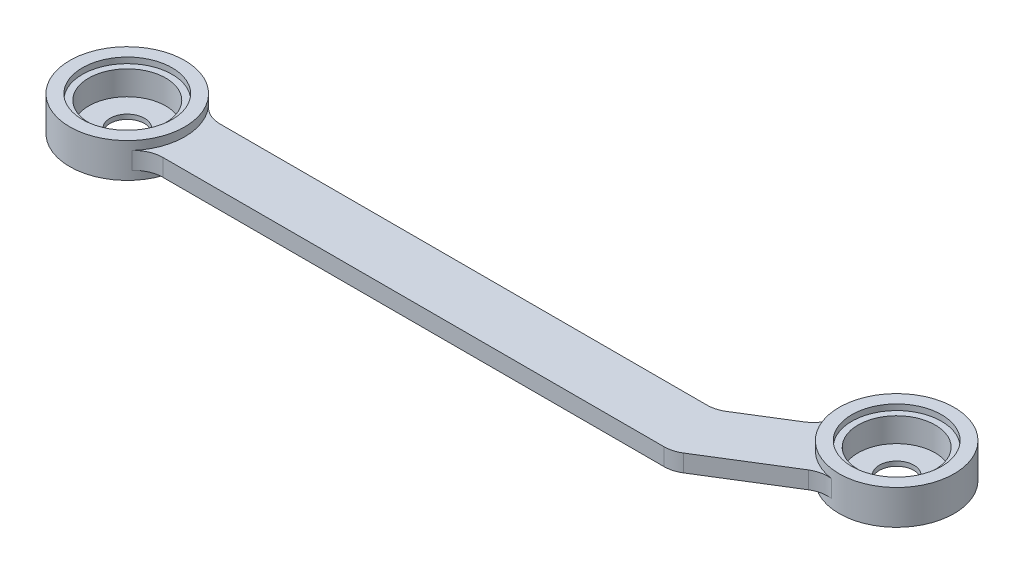
ISO-10303-21;
HEADER;
FILE_DESCRIPTION(('STEP AP214'),'2;1');
FILE_NAME('part.step','',(''),(''),'','','');
FILE_SCHEMA(('AUTOMOTIVE_DESIGN { 1 0 10303 214 1 1 1 1 }'));
ENDSEC;
DATA;
#1=APPLICATION_CONTEXT('core data for automotive mechanical design processes');
#2=APPLICATION_PROTOCOL_DEFINITION('international standard','automotive_design',2000,#1);
#3=PRODUCT_CONTEXT('',#1,'mechanical');
#4=PRODUCT('Part','Part','',(#3));
#5=PRODUCT_RELATED_PRODUCT_CATEGORY('part','',(#4));
#6=PRODUCT_DEFINITION_FORMATION('','',#4);
#7=PRODUCT_DEFINITION_CONTEXT('part definition',#1,'design');
#8=PRODUCT_DEFINITION('design','',#6,#7);
#9=PRODUCT_DEFINITION_SHAPE('','',#8);
#10=(LENGTH_UNIT() NAMED_UNIT(*) SI_UNIT(.MILLI.,.METRE.));
#11=(NAMED_UNIT(*) PLANE_ANGLE_UNIT() SI_UNIT($,.RADIAN.));
#12=(NAMED_UNIT(*) SI_UNIT($,.STERADIAN.) SOLID_ANGLE_UNIT());
#13=UNCERTAINTY_MEASURE_WITH_UNIT(LENGTH_MEASURE(1.E-05),#10,'distance_accuracy_value','');
#14=(GEOMETRIC_REPRESENTATION_CONTEXT(3) GLOBAL_UNCERTAINTY_ASSIGNED_CONTEXT((#13)) GLOBAL_UNIT_ASSIGNED_CONTEXT((#10,
#11,#12)) REPRESENTATION_CONTEXT('',''));
#15=CARTESIAN_POINT('',(0.,0.,0.));
#16=DIRECTION('',(0.,0.,1.));
#17=DIRECTION('',(1.,0.,0.));
#18=AXIS2_PLACEMENT_3D('',#15,#16,#17);
#19=CARTESIAN_POINT('',(11.180339887499,3.,-10.));
#20=DIRECTION('',(0.,-1.,0.));
#21=DIRECTION('',(0.,0.,-1.));
#22=AXIS2_PLACEMENT_3D('',#19,#20,#21);
#23=CYLINDRICAL_SURFACE('',#22,5.);
#24=DIRECTION('',(0.,-1.,0.));
#25=VECTOR('',#24,1.);
#26=CARTESIAN_POINT('',(11.180339887499,3.,-5.));
#27=LINE('',#26,#25);
#28=CARTESIAN_POINT('',(11.180339887499,1.5,-5.));
#29=VERTEX_POINT('',#28);
#30=CARTESIAN_POINT('',(11.180339887499,-1.5,-5.));
#31=VERTEX_POINT('',#30);
#32=EDGE_CURVE('E217',#29,#31,#27,.T.);
#33=ORIENTED_EDGE('',*,*,#32,.T.);
#34=CARTESIAN_POINT('',(11.180339887499,-1.5,-10.));
#35=DIRECTION('',(0.,-1.,0.));
#36=DIRECTION('',(0.,0.,-1.));
#37=AXIS2_PLACEMENT_3D('',#34,#35,#36);
#38=CIRCLE('',#37,5.);
#39=CARTESIAN_POINT('',(7.4535599249993,-1.5,-6.66666666666667));
#40=VERTEX_POINT('',#39);
#41=EDGE_CURVE('E348',#40,#31,#38,.F.);
#42=ORIENTED_EDGE('',*,*,#41,.F.);
#43=DIRECTION('',(0.,-1.,0.));
#44=VECTOR('',#43,1.);
#45=CARTESIAN_POINT('',(7.4535599249993,3.,-6.66666666666667));
#46=LINE('',#45,#44);
#47=CARTESIAN_POINT('',(7.4535599249993,1.5,-6.66666666666667));
#48=VERTEX_POINT('',#47);
#49=EDGE_CURVE('E11',#48,#40,#46,.T.);
#50=ORIENTED_EDGE('',*,*,#49,.F.);
#51=CARTESIAN_POINT('',(11.180339887499,1.5,-10.));
#52=DIRECTION('',(0.,1.,0.));
#53=DIRECTION('',(0.,0.,1.));
#54=AXIS2_PLACEMENT_3D('',#51,#52,#53);
#55=CIRCLE('',#54,5.);
#56=EDGE_CURVE('E277',#29,#48,#55,.F.);
#57=ORIENTED_EDGE('',*,*,#56,.F.);
#58=EDGE_LOOP('',(#33,#42,#50,#57));
#59=FACE_BOUND('',#58,.T.);
#60=ADVANCED_FACE('F39',(#59),#23,.F.);
#61=CARTESIAN_POINT('',(11.180339887499,3.,10.));
#62=DIRECTION('',(0.,-1.,0.));
#63=DIRECTION('',(0.,0.,-1.));
#64=AXIS2_PLACEMENT_3D('',#61,#62,#63);
#65=CYLINDRICAL_SURFACE('',#64,5.);
#66=DIRECTION('',(0.,-1.,0.));
#67=VECTOR('',#66,1.);
#68=CARTESIAN_POINT('',(7.4535599249993,3.,6.66666666666667));
#69=LINE('',#68,#67);
#70=CARTESIAN_POINT('',(7.4535599249993,1.5,6.66666666666667));
#71=VERTEX_POINT('',#70);
#72=CARTESIAN_POINT('',(7.4535599249993,-1.5,6.66666666666667));
#73=VERTEX_POINT('',#72);
#74=EDGE_CURVE('E49',#71,#73,#69,.T.);
#75=ORIENTED_EDGE('',*,*,#74,.T.);
#76=CARTESIAN_POINT('',(11.180339887499,-1.5,10.));
#77=DIRECTION('',(0.,-1.,0.));
#78=DIRECTION('',(0.,0.,-1.));
#79=AXIS2_PLACEMENT_3D('',#76,#77,#78);
#80=CIRCLE('',#79,5.);
#81=CARTESIAN_POINT('',(11.180339887499,-1.5,5.));
#82=VERTEX_POINT('',#81);
#83=EDGE_CURVE('E365',#82,#73,#80,.F.);
#84=ORIENTED_EDGE('',*,*,#83,.F.);
#85=DIRECTION('',(0.,-1.,0.));
#86=VECTOR('',#85,1.);
#87=CARTESIAN_POINT('',(11.180339887499,3.,5.));
#88=LINE('',#87,#86);
#89=CARTESIAN_POINT('',(11.180339887499,1.5,5.));
#90=VERTEX_POINT('',#89);
#91=EDGE_CURVE('E171',#90,#82,#88,.T.);
#92=ORIENTED_EDGE('',*,*,#91,.F.);
#93=CARTESIAN_POINT('',(11.180339887499,1.5,10.));
#94=DIRECTION('',(0.,1.,0.));
#95=DIRECTION('',(0.,0.,1.));
#96=AXIS2_PLACEMENT_3D('',#93,#94,#95);
#97=CIRCLE('',#96,5.);
#98=EDGE_CURVE('E284',#71,#90,#97,.F.);
#99=ORIENTED_EDGE('',*,*,#98,.F.);
#100=EDGE_LOOP('',(#75,#84,#92,#99));
#101=FACE_BOUND('',#100,.T.);
#102=ADVANCED_FACE('F337',(#101),#65,.F.);
#103=CARTESIAN_POINT('',(0.,3.,5.));
#104=DIRECTION('',(0.,0.,-1.));
#105=DIRECTION('',(-1.,0.,0.));
#106=AXIS2_PLACEMENT_3D('',#103,#104,#105);
#107=PLANE('',#106);
#108=DIRECTION('',(-1.,0.,0.));
#109=VECTOR('',#108,1.);
#110=CARTESIAN_POINT('',(0.,-1.5,5.));
#111=LINE('',#110,#109);
#112=CARTESIAN_POINT('',(98.3184692391875,-1.5,5.));
#113=VERTEX_POINT('',#112);
#114=EDGE_CURVE('E369',#113,#82,#111,.T.);
#115=ORIENTED_EDGE('',*,*,#114,.F.);
#116=DIRECTION('',(0.,-1.,0.));
#117=VECTOR('',#116,1.);
#118=CARTESIAN_POINT('',(98.3184692391875,3.,5.));
#119=LINE('',#118,#117);
#120=CARTESIAN_POINT('',(98.3184692391875,1.5,5.));
#121=VERTEX_POINT('',#120);
#122=EDGE_CURVE('E167',#121,#113,#119,.T.);
#123=ORIENTED_EDGE('',*,*,#122,.F.);
#124=DIRECTION('',(1.,0.,0.));
#125=VECTOR('',#124,1.);
#126=CARTESIAN_POINT('',(0.,1.5,5.));
#127=LINE('',#126,#125);
#128=EDGE_CURVE('E287',#90,#121,#127,.T.);
#129=ORIENTED_EDGE('',*,*,#128,.F.);
#130=ORIENTED_EDGE('',*,*,#91,.T.);
#131=EDGE_LOOP('',(#115,#123,#129,#130));
#132=FACE_BOUND('',#131,.T.);
#133=ADVANCED_FACE('F342',(#132),#107,.F.);
#134=CARTESIAN_POINT('',(98.3184692391875,3.,0.));
#135=DIRECTION('',(0.,-1.,0.));
#136=DIRECTION('',(0.,0.,-1.));
#137=AXIS2_PLACEMENT_3D('',#134,#135,#136);
#138=CYLINDRICAL_SURFACE('',#137,5.);
#139=ORIENTED_EDGE('',*,*,#122,.T.);
#140=CARTESIAN_POINT('',(98.3184692391875,-1.5,0.));
#141=DIRECTION('',(0.,-1.,0.));
#142=DIRECTION('',(0.,0.,-1.));
#143=AXIS2_PLACEMENT_3D('',#140,#141,#142);
#144=CIRCLE('',#143,5.);
#145=CARTESIAN_POINT('',(100.953895223522,-1.5,4.2490622354933));
#146=VERTEX_POINT('',#145);
#147=EDGE_CURVE('E372',#146,#113,#144,.T.);
#148=ORIENTED_EDGE('',*,*,#147,.F.);
#149=DIRECTION('',(0.,-1.,0.));
#150=VECTOR('',#149,1.);
#151=CARTESIAN_POINT('',(100.953895223522,3.,4.24906223549331));
#152=LINE('',#151,#150);
#153=CARTESIAN_POINT('',(100.953895223522,1.5,4.24906223549331));
#154=VERTEX_POINT('',#153);
#155=EDGE_CURVE('E158',#154,#146,#152,.T.);
#156=ORIENTED_EDGE('',*,*,#155,.F.);
#157=CARTESIAN_POINT('',(98.3184692391875,1.5,0.));
#158=DIRECTION('',(0.,1.,0.));
#159=DIRECTION('',(0.,0.,1.));
#160=AXIS2_PLACEMENT_3D('',#157,#158,#159);
#161=CIRCLE('',#160,5.);
#162=EDGE_CURVE('E290',#121,#154,#161,.T.);
#163=ORIENTED_EDGE('',*,*,#162,.F.);
#164=EDGE_LOOP('',(#139,#148,#156,#163));
#165=FACE_BOUND('',#164,.T.);
#166=ADVANCED_FACE('F381',(#165),#138,.T.);
#167=CARTESIAN_POINT('',(29.9501455938231,3.,48.2882210871058));
#168=DIRECTION('',(-0.527085196866867,0.,-0.849812447098662));
#169=DIRECTION('',(-0.849812447098662,0.,0.527085196866867));
#170=AXIS2_PLACEMENT_3D('',#167,#168,#169);
#171=PLANE('',#170);
#172=DIRECTION('',(-0.849812447098662,0.,0.527085196866867));
#173=VECTOR('',#172,1.);
#174=CARTESIAN_POINT('',(29.9501455938231,-1.5,48.2882210871058));
#175=LINE('',#174,#173);
#176=CARTESIAN_POINT('',(114.335793642608,-1.5,-4.05088746135743));
#177=VERTEX_POINT('',#176);
#178=EDGE_CURVE('E149',#177,#146,#175,.T.);
#179=ORIENTED_EDGE('',*,*,#178,.F.);
#180=DIRECTION('',(0.,-1.,0.));
#181=VECTOR('',#180,1.);
#182=CARTESIAN_POINT('',(114.335793642608,3.,-4.05088746135743));
#183=LINE('',#182,#181);
#184=CARTESIAN_POINT('',(114.335793642608,1.5,-4.05088746135744));
#185=VERTEX_POINT('',#184);
#186=EDGE_CURVE('E147',#185,#177,#183,.T.);
#187=ORIENTED_EDGE('',*,*,#186,.F.);
#188=DIRECTION('',(0.849812447098662,0.,-0.527085196866867));
#189=VECTOR('',#188,1.);
#190=CARTESIAN_POINT('',(29.9501455938231,1.5,48.2882210871058));
#191=LINE('',#190,#189);
#192=EDGE_CURVE('E64',#154,#185,#191,.T.);
#193=ORIENTED_EDGE('',*,*,#192,.F.);
#194=ORIENTED_EDGE('',*,*,#155,.T.);
#195=EDGE_LOOP('',(#179,#187,#193,#194));
#196=FACE_BOUND('',#195,.T.);
#197=ADVANCED_FACE('F384',(#196),#171,.F.);
#198=CARTESIAN_POINT('',(116.971219626942,3.,0.19817477413587));
#199=DIRECTION('',(0.,-1.,0.));
#200=DIRECTION('',(0.,0.,-1.));
#201=AXIS2_PLACEMENT_3D('',#198,#199,#200);
#202=CYLINDRICAL_SURFACE('',#201,5.);
#203=CARTESIAN_POINT('',(116.971219626942,-1.5,0.19817477413587));
#204=DIRECTION('',(0.,-1.,0.));
#205=DIRECTION('',(0.,0.,-1.));
#206=AXIS2_PLACEMENT_3D('',#203,#204,#205);
#207=CIRCLE('',#206,5.);
#208=CARTESIAN_POINT('',(117.680813084628,-1.5,-4.75121681724276));
#209=VERTEX_POINT('',#208);
#210=EDGE_CURVE('E134',#209,#177,#207,.F.);
#211=ORIENTED_EDGE('',*,*,#210,.F.);
#212=DIRECTION('',(0.,-1.,0.));
#213=VECTOR('',#212,1.);
#214=CARTESIAN_POINT('',(117.680813084628,3.,-4.75121681724276));
#215=LINE('',#214,#213);
#216=CARTESIAN_POINT('',(117.680813084628,1.5,-4.75121681724276));
#217=VERTEX_POINT('',#216);
#218=EDGE_CURVE('E145',#217,#209,#215,.T.);
#219=ORIENTED_EDGE('',*,*,#218,.F.);
#220=CARTESIAN_POINT('',(116.971219626942,1.5,0.19817477413587));
#221=DIRECTION('',(0.,1.,0.));
#222=DIRECTION('',(0.,0.,1.));
#223=AXIS2_PLACEMENT_3D('',#220,#221,#222);
#224=CIRCLE('',#223,5.);
#225=EDGE_CURVE('E295',#185,#217,#224,.F.);
#226=ORIENTED_EDGE('',*,*,#225,.F.);
#227=ORIENTED_EDGE('',*,*,#186,.T.);
#228=EDGE_LOOP('',(#211,#219,#226,#227));
#229=FACE_BOUND('',#228,.T.);
#230=ADVANCED_FACE('F144',(#229),#202,.F.);
#231=CARTESIAN_POINT('',(104.108710614504,3.,-15.1611189297056));
#232=DIRECTION('',(0.,-1.,0.));
#233=DIRECTION('',(0.,0.,-1.));
#234=AXIS2_PLACEMENT_3D('',#231,#232,#233);
#235=CYLINDRICAL_SURFACE('',#234,4.99999999999999);
#236=CARTESIAN_POINT('',(104.108710614504,-1.5,-15.1611189297056));
#237=DIRECTION('',(0.,-1.,0.));
#238=DIRECTION('',(0.,0.,-1.));
#239=AXIS2_PLACEMENT_3D('',#236,#237,#238);
#240=CIRCLE('',#239,4.99999999999999);
#241=CARTESIAN_POINT('',(106.744136598838,-1.5,-10.9120566942123));
#242=VERTEX_POINT('',#241);
#243=CARTESIAN_POINT('',(109.105807076336,-1.5,-14.990745953137));
#244=VERTEX_POINT('',#243);
#245=EDGE_CURVE('E137',#242,#244,#240,.F.);
#246=ORIENTED_EDGE('',*,*,#245,.F.);
#247=DIRECTION('',(0.,-1.,0.));
#248=VECTOR('',#247,1.);
#249=CARTESIAN_POINT('',(106.744136598838,3.,-10.9120566942122));
#250=LINE('',#249,#248);
#251=CARTESIAN_POINT('',(106.744136598838,1.5,-10.9120566942122));
#252=VERTEX_POINT('',#251);
#253=EDGE_CURVE('E160',#252,#242,#250,.T.);
#254=ORIENTED_EDGE('',*,*,#253,.F.);
#255=CARTESIAN_POINT('',(104.108710614504,1.5,-15.1611189297056));
#256=DIRECTION('',(0.,1.,0.));
#257=DIRECTION('',(0.,0.,1.));
#258=AXIS2_PLACEMENT_3D('',#255,#256,#257);
#259=CIRCLE('',#258,4.99999999999999);
#260=CARTESIAN_POINT('',(109.105807076336,1.5,-14.990745953137));
#261=VERTEX_POINT('',#260);
#262=EDGE_CURVE('E257',#261,#252,#259,.F.);
#263=ORIENTED_EDGE('',*,*,#262,.F.);
#264=DIRECTION('',(0.,-1.,0.));
#265=VECTOR('',#264,1.);
#266=CARTESIAN_POINT('',(109.105807076336,3.,-14.990745953137));
#267=LINE('',#266,#265);
#268=EDGE_CURVE('E154',#261,#244,#267,.T.);
#269=ORIENTED_EDGE('',*,*,#268,.T.);
#270=EDGE_LOOP('',(#246,#254,#263,#269));
#271=FACE_BOUND('',#270,.T.);
#272=ADVANCED_FACE('F256',(#271),#235,.F.);
#273=CARTESIAN_POINT('',(24.7677611525447,3.,39.9327316329765));
#274=DIRECTION('',(-0.527085196866867,0.,-0.849812447098662));
#275=DIRECTION('',(-0.849812447098662,0.,0.527085196866867));
#276=AXIS2_PLACEMENT_3D('',#273,#274,#275);
#277=PLANE('',#276);
#278=ORIENTED_EDGE('',*,*,#253,.T.);
#279=DIRECTION('',(0.849812447098662,0.,-0.527085196866867));
#280=VECTOR('',#279,1.);
#281=CARTESIAN_POINT('',(24.7677611525447,-1.5,39.9327316329765));
#282=LINE('',#281,#280);
#283=CARTESIAN_POINT('',(98.4229332459612,-1.5,-5.75093776450671));
#284=VERTEX_POINT('',#283);
#285=EDGE_CURVE('E252',#284,#242,#282,.T.);
#286=ORIENTED_EDGE('',*,*,#285,.F.);
#287=DIRECTION('',(0.,-1.,0.));
#288=VECTOR('',#287,1.);
#289=CARTESIAN_POINT('',(98.4229332459612,3.,-5.75093776450671));
#290=LINE('',#289,#288);
#291=CARTESIAN_POINT('',(98.4229332459612,1.5,-5.75093776450671));
#292=VERTEX_POINT('',#291);
#293=EDGE_CURVE('E241',#292,#284,#290,.T.);
#294=ORIENTED_EDGE('',*,*,#293,.F.);
#295=DIRECTION('',(-0.849812447098662,0.,0.527085196866867));
#296=VECTOR('',#295,1.);
#297=CARTESIAN_POINT('',(24.7677611525447,1.5,39.9327316329765));
#298=LINE('',#297,#296);
#299=EDGE_CURVE('E253',#252,#292,#298,.T.);
#300=ORIENTED_EDGE('',*,*,#299,.F.);
#301=EDGE_LOOP('',(#278,#286,#294,#300));
#302=FACE_BOUND('',#301,.T.);
#303=ADVANCED_FACE('F250',(#302),#277,.T.);
#304=CARTESIAN_POINT('',(95.7875072616268,3.,-10.));
#305=DIRECTION('',(0.,-1.,0.));
#306=DIRECTION('',(0.,0.,-1.));
#307=AXIS2_PLACEMENT_3D('',#304,#305,#306);
#308=CYLINDRICAL_SURFACE('',#307,5.);
#309=CARTESIAN_POINT('',(95.7875072616268,-1.5,-10.));
#310=DIRECTION('',(0.,-1.,0.));
#311=DIRECTION('',(0.,0.,-1.));
#312=AXIS2_PLACEMENT_3D('',#309,#310,#311);
#313=CIRCLE('',#312,5.);
#314=CARTESIAN_POINT('',(95.7875072616268,-1.5,-5.));
#315=VERTEX_POINT('',#314);
#316=EDGE_CURVE('E263',#315,#284,#313,.F.);
#317=ORIENTED_EDGE('',*,*,#316,.F.);
#318=DIRECTION('',(0.,-1.,0.));
#319=VECTOR('',#318,1.);
#320=CARTESIAN_POINT('',(95.7875072616268,3.,-5.));
#321=LINE('',#320,#319);
#322=CARTESIAN_POINT('',(95.7875072616268,1.5,-5.));
#323=VERTEX_POINT('',#322);
#324=EDGE_CURVE('E237',#323,#315,#321,.T.);
#325=ORIENTED_EDGE('',*,*,#324,.F.);
#326=CARTESIAN_POINT('',(95.7875072616268,1.5,-10.));
#327=DIRECTION('',(0.,1.,0.));
#328=DIRECTION('',(0.,0.,1.));
#329=AXIS2_PLACEMENT_3D('',#326,#327,#328);
#330=CIRCLE('',#329,5.);
#331=EDGE_CURVE('E271',#292,#323,#330,.F.);
#332=ORIENTED_EDGE('',*,*,#331,.F.);
#333=ORIENTED_EDGE('',*,*,#293,.T.);
#334=EDGE_LOOP('',(#317,#325,#332,#333));
#335=FACE_BOUND('',#334,.T.);
#336=ADVANCED_FACE('F406',(#335),#308,.F.);
#337=CARTESIAN_POINT('',(0.,3.,-5.));
#338=DIRECTION('',(0.,0.,-1.));
#339=DIRECTION('',(-1.,0.,0.));
#340=AXIS2_PLACEMENT_3D('',#337,#338,#339);
#341=PLANE('',#340);
#342=ORIENTED_EDGE('',*,*,#324,.T.);
#343=DIRECTION('',(1.,0.,0.));
#344=VECTOR('',#343,1.);
#345=CARTESIAN_POINT('',(0.,-1.5,-5.));
#346=LINE('',#345,#344);
#347=EDGE_CURVE('E354',#31,#315,#346,.T.);
#348=ORIENTED_EDGE('',*,*,#347,.F.);
#349=ORIENTED_EDGE('',*,*,#32,.F.);
#350=DIRECTION('',(-1.,0.,0.));
#351=VECTOR('',#350,1.);
#352=CARTESIAN_POINT('',(0.,1.5,-5.));
#353=LINE('',#352,#351);
#354=EDGE_CURVE('E274',#323,#29,#353,.T.);
#355=ORIENTED_EDGE('',*,*,#354,.F.);
#356=EDGE_LOOP('',(#342,#348,#349,#355));
#357=FACE_BOUND('',#356,.T.);
#358=ADVANCED_FACE('F352',(#357),#341,.T.);
#359=CARTESIAN_POINT('',(0.,-3.,0.));
#360=DIRECTION('',(0.,1.,0.));
#361=DIRECTION('',(0.,0.,1.));
#362=AXIS2_PLACEMENT_3D('',#359,#360,#361);
#363=PLANE('',#362);
#364=CARTESIAN_POINT('',(119.1,-3.,-14.65));
#365=DIRECTION('',(0.,1.,0.));
#366=DIRECTION('',(0.,0.,1.));
#367=AXIS2_PLACEMENT_3D('',#364,#365,#366);
#368=CIRCLE('',#367,3.00000000000001);
#369=CARTESIAN_POINT('',(119.1,-3.,-11.65));
#370=VERTEX_POINT('',#369);
#371=EDGE_CURVE('E213',#370,#370,#368,.T.);
#372=ORIENTED_EDGE('',*,*,#371,.T.);
#373=EDGE_LOOP('',(#372));
#374=FACE_BOUND('',#373,.T.);
#375=CARTESIAN_POINT('',(119.1,-3.,-14.65));
#376=DIRECTION('',(0.,1.,0.));
#377=DIRECTION('',(0.,0.,1.));
#378=AXIS2_PLACEMENT_3D('',#375,#376,#377);
#379=CIRCLE('',#378,9.99999999999999);
#380=CARTESIAN_POINT('',(119.1,-3.,-4.65));
#381=VERTEX_POINT('',#380);
#382=EDGE_CURVE('E227',#381,#381,#379,.T.);
#383=ORIENTED_EDGE('',*,*,#382,.F.);
#384=EDGE_LOOP('',(#383));
#385=FACE_BOUND('',#384,.T.);
#386=ADVANCED_FACE('F413',(#374,#385),#363,.F.);
#387=CARTESIAN_POINT('',(0.,-3.,0.));
#388=DIRECTION('',(0.,1.,0.));
#389=DIRECTION('',(0.,0.,1.));
#390=AXIS2_PLACEMENT_3D('',#387,#388,#389);
#391=CIRCLE('',#390,3.);
#392=CARTESIAN_POINT('',(0.,-3.,3.));
#393=VERTEX_POINT('',#392);
#394=EDGE_CURVE('E218',#393,#393,#391,.T.);
#395=ORIENTED_EDGE('',*,*,#394,.T.);
#396=EDGE_LOOP('',(#395));
#397=FACE_BOUND('',#396,.T.);
#398=CARTESIAN_POINT('',(0.,-3.,0.));
#399=DIRECTION('',(0.,1.,0.));
#400=DIRECTION('',(0.,0.,1.));
#401=AXIS2_PLACEMENT_3D('',#398,#399,#400);
#402=CIRCLE('',#401,10.);
#403=CARTESIAN_POINT('',(0.,-3.,10.));
#404=VERTEX_POINT('',#403);
#405=EDGE_CURVE('E222',#404,#404,#402,.T.);
#406=ORIENTED_EDGE('',*,*,#405,.F.);
#407=EDGE_LOOP('',(#406));
#408=FACE_BOUND('',#407,.T.);
#409=ADVANCED_FACE('F445',(#397,#408),#363,.F.);
#410=CARTESIAN_POINT('',(0.,3.,0.));
#411=DIRECTION('',(0.,1.,0.));
#412=DIRECTION('',(0.,0.,1.));
#413=AXIS2_PLACEMENT_3D('',#410,#411,#412);
#414=PLANE('',#413);
#415=CARTESIAN_POINT('',(119.1,3.,-14.65));
#416=DIRECTION('',(0.,1.,0.));
#417=DIRECTION('',(0.,0.,1.));
#418=AXIS2_PLACEMENT_3D('',#415,#416,#417);
#419=CIRCLE('',#418,7.79999999999998);
#420=CARTESIAN_POINT('',(119.1,3.,-6.85000000000002));
#421=VERTEX_POINT('',#420);
#422=EDGE_CURVE('E198',#421,#421,#419,.T.);
#423=ORIENTED_EDGE('',*,*,#422,.F.);
#424=EDGE_LOOP('',(#423));
#425=FACE_BOUND('',#424,.T.);
#426=CARTESIAN_POINT('',(119.1,3.,-14.65));
#427=DIRECTION('',(0.,1.,0.));
#428=DIRECTION('',(0.,0.,1.));
#429=AXIS2_PLACEMENT_3D('',#426,#427,#428);
#430=CIRCLE('',#429,9.99999999999999);
#431=CARTESIAN_POINT('',(119.1,3.,-4.65));
#432=VERTEX_POINT('',#431);
#433=EDGE_CURVE('E212',#432,#432,#430,.T.);
#434=ORIENTED_EDGE('',*,*,#433,.T.);
#435=EDGE_LOOP('',(#434));
#436=FACE_BOUND('',#435,.T.);
#437=ADVANCED_FACE('F316',(#425,#436),#414,.T.);
#438=CARTESIAN_POINT('',(0.,3.,0.));
#439=DIRECTION('',(0.,1.,0.));
#440=DIRECTION('',(0.,0.,1.));
#441=AXIS2_PLACEMENT_3D('',#438,#439,#440);
#442=CIRCLE('',#441,7.8);
#443=CARTESIAN_POINT('',(0.,3.,7.8));
#444=VERTEX_POINT('',#443);
#445=EDGE_CURVE('E204',#444,#444,#442,.T.);
#446=ORIENTED_EDGE('',*,*,#445,.F.);
#447=EDGE_LOOP('',(#446));
#448=FACE_BOUND('',#447,.T.);
#449=CARTESIAN_POINT('',(0.,3.,0.));
#450=DIRECTION('',(0.,1.,0.));
#451=DIRECTION('',(0.,0.,1.));
#452=AXIS2_PLACEMENT_3D('',#449,#450,#451);
#453=CIRCLE('',#452,10.);
#454=CARTESIAN_POINT('',(0.,3.,10.));
#455=VERTEX_POINT('',#454);
#456=EDGE_CURVE('E208',#455,#455,#453,.T.);
#457=ORIENTED_EDGE('',*,*,#456,.T.);
#458=EDGE_LOOP('',(#457));
#459=FACE_BOUND('',#458,.T.);
#460=ADVANCED_FACE('F313',(#448,#459),#414,.T.);
#461=CARTESIAN_POINT('',(0.,3.,0.));
#462=DIRECTION('',(0.,-1.,0.));
#463=DIRECTION('',(0.,0.,-1.));
#464=AXIS2_PLACEMENT_3D('',#461,#462,#463);
#465=CYLINDRICAL_SURFACE('',#464,3.);
#466=ORIENTED_EDGE('',*,*,#394,.F.);
#467=EDGE_LOOP('',(#466));
#468=FACE_BOUND('',#467,.T.);
#469=CARTESIAN_POINT('',(0.,-2.2,0.));
#470=DIRECTION('',(0.,1.,0.));
#471=DIRECTION('',(0.,0.,1.));
#472=AXIS2_PLACEMENT_3D('',#469,#470,#471);
#473=CIRCLE('',#472,3.);
#474=CARTESIAN_POINT('',(0.,-2.2,3.));
#475=VERTEX_POINT('',#474);
#476=EDGE_CURVE('E43',#475,#475,#473,.T.);
#477=ORIENTED_EDGE('',*,*,#476,.T.);
#478=EDGE_LOOP('',(#477));
#479=FACE_BOUND('',#478,.T.);
#480=ADVANCED_FACE('F41',(#468,#479),#465,.F.);
#481=CARTESIAN_POINT('',(119.1,3.,-14.65));
#482=DIRECTION('',(0.,-1.,0.));
#483=DIRECTION('',(0.,0.,-1.));
#484=AXIS2_PLACEMENT_3D('',#481,#482,#483);
#485=CYLINDRICAL_SURFACE('',#484,3.00000000000001);
#486=ORIENTED_EDGE('',*,*,#371,.F.);
#487=EDGE_LOOP('',(#486));
#488=FACE_BOUND('',#487,.T.);
#489=CARTESIAN_POINT('',(119.1,-2.2,-14.65));
#490=DIRECTION('',(0.,1.,0.));
#491=DIRECTION('',(0.,0.,1.));
#492=AXIS2_PLACEMENT_3D('',#489,#490,#491);
#493=CIRCLE('',#492,3.00000000000001);
#494=CARTESIAN_POINT('',(119.1,-2.2,-11.65));
#495=VERTEX_POINT('',#494);
#496=EDGE_CURVE('E186',#495,#495,#493,.T.);
#497=ORIENTED_EDGE('',*,*,#496,.T.);
#498=EDGE_LOOP('',(#497));
#499=FACE_BOUND('',#498,.T.);
#500=ADVANCED_FACE('F322',(#488,#499),#485,.F.);
#501=CARTESIAN_POINT('',(0.,3.,0.));
#502=DIRECTION('',(0.,-1.,0.));
#503=DIRECTION('',(0.,0.,-1.));
#504=AXIS2_PLACEMENT_3D('',#501,#502,#503);
#505=CYLINDRICAL_SURFACE('',#504,10.);
#506=ORIENTED_EDGE('',*,*,#405,.T.);
#507=EDGE_LOOP('',(#506));
#508=FACE_BOUND('',#507,.T.);
#509=CARTESIAN_POINT('',(0.,1.5,0.));
#510=DIRECTION('',(0.,1.,0.));
#511=DIRECTION('',(0.,0.,1.));
#512=AXIS2_PLACEMENT_3D('',#509,#510,#511);
#513=CIRCLE('',#512,10.);
#514=EDGE_CURVE('E281',#71,#48,#513,.T.);
#515=ORIENTED_EDGE('',*,*,#514,.T.);
#516=ORIENTED_EDGE('',*,*,#49,.T.);
#517=CARTESIAN_POINT('',(0.,-1.5,0.));
#518=DIRECTION('',(0.,-1.,0.));
#519=DIRECTION('',(0.,0.,-1.));
#520=AXIS2_PLACEMENT_3D('',#517,#518,#519);
#521=CIRCLE('',#520,10.);
#522=EDGE_CURVE('E360',#40,#73,#521,.T.);
#523=ORIENTED_EDGE('',*,*,#522,.T.);
#524=ORIENTED_EDGE('',*,*,#74,.F.);
#525=EDGE_LOOP('',(#515,#516,#523,#524));
#526=FACE_BOUND('',#525,.T.);
#527=ORIENTED_EDGE('',*,*,#456,.F.);
#528=EDGE_LOOP('',(#527));
#529=FACE_BOUND('',#528,.T.);
#530=ADVANCED_FACE('F320',(#508,#526,#529),#505,.T.);
#531=CARTESIAN_POINT('',(119.1,3.,-14.65));
#532=DIRECTION('',(0.,-1.,0.));
#533=DIRECTION('',(0.,0.,-1.));
#534=AXIS2_PLACEMENT_3D('',#531,#532,#533);
#535=CYLINDRICAL_SURFACE('',#534,9.99999999999999);
#536=ORIENTED_EDGE('',*,*,#382,.T.);
#537=EDGE_LOOP('',(#536));
#538=FACE_BOUND('',#537,.T.);
#539=CARTESIAN_POINT('',(119.1,1.5,-14.65));
#540=DIRECTION('',(0.,1.,0.));
#541=DIRECTION('',(0.,0.,1.));
#542=AXIS2_PLACEMENT_3D('',#539,#540,#541);
#543=CIRCLE('',#542,9.99999999999999);
#544=EDGE_CURVE('E57',#261,#217,#543,.T.);
#545=ORIENTED_EDGE('',*,*,#544,.T.);
#546=ORIENTED_EDGE('',*,*,#218,.T.);
#547=CARTESIAN_POINT('',(119.1,-1.5,-14.65));
#548=DIRECTION('',(0.,-1.,0.));
#549=DIRECTION('',(0.,0.,-1.));
#550=AXIS2_PLACEMENT_3D('',#547,#548,#549);
#551=CIRCLE('',#550,9.99999999999999);
#552=EDGE_CURVE('E131',#209,#244,#551,.T.);
#553=ORIENTED_EDGE('',*,*,#552,.T.);
#554=ORIENTED_EDGE('',*,*,#268,.F.);
#555=EDGE_LOOP('',(#545,#546,#553,#554));
#556=FACE_BOUND('',#555,.T.);
#557=ORIENTED_EDGE('',*,*,#433,.F.);
#558=EDGE_LOOP('',(#557));
#559=FACE_BOUND('',#558,.T.);
#560=ADVANCED_FACE('F151',(#538,#556,#559),#535,.T.);
#561=CARTESIAN_POINT('',(119.1,2.,-14.65));
#562=DIRECTION('',(0.,1.,0.));
#563=DIRECTION('',(0.,0.,1.));
#564=AXIS2_PLACEMENT_3D('',#561,#562,#563);
#565=CYLINDRICAL_SURFACE('',#564,7.79999999999998);
#566=CARTESIAN_POINT('',(119.1,2.,-14.65));
#567=DIRECTION('',(0.,1.,0.));
#568=DIRECTION('',(0.,0.,1.));
#569=AXIS2_PLACEMENT_3D('',#566,#567,#568);
#570=CIRCLE('',#569,7.79999999999998);
#571=CARTESIAN_POINT('',(119.1,2.,-6.85000000000002));
#572=VERTEX_POINT('',#571);
#573=EDGE_CURVE('E193',#572,#572,#570,.T.);
#574=ORIENTED_EDGE('',*,*,#573,.F.);
#575=EDGE_LOOP('',(#574));
#576=FACE_BOUND('',#575,.T.);
#577=ORIENTED_EDGE('',*,*,#422,.T.);
#578=EDGE_LOOP('',(#577));
#579=FACE_BOUND('',#578,.T.);
#580=ADVANCED_FACE('F329',(#576,#579),#565,.F.);
#581=CARTESIAN_POINT('',(119.1,2.,-14.65));
#582=DIRECTION('',(0.,1.,0.));
#583=DIRECTION('',(0.,0.,1.));
#584=AXIS2_PLACEMENT_3D('',#581,#582,#583);
#585=PLANE('',#584);
#586=CARTESIAN_POINT('',(119.1,2.,-14.65));
#587=DIRECTION('',(0.,1.,0.));
#588=DIRECTION('',(0.,0.,1.));
#589=AXIS2_PLACEMENT_3D('',#586,#587,#588);
#590=CIRCLE('',#589,6.69999999999999);
#591=CARTESIAN_POINT('',(119.1,2.,-7.95000000000001));
#592=VERTEX_POINT('',#591);
#593=EDGE_CURVE('E182',#592,#592,#590,.T.);
#594=ORIENTED_EDGE('',*,*,#593,.F.);
#595=EDGE_LOOP('',(#594));
#596=FACE_BOUND('',#595,.T.);
#597=ORIENTED_EDGE('',*,*,#573,.T.);
#598=EDGE_LOOP('',(#597));
#599=FACE_BOUND('',#598,.T.);
#600=ADVANCED_FACE('F537',(#596,#599),#585,.T.);
#601=CARTESIAN_POINT('',(0.,2.,0.));
#602=DIRECTION('',(0.,1.,0.));
#603=DIRECTION('',(0.,0.,1.));
#604=AXIS2_PLACEMENT_3D('',#601,#602,#603);
#605=CYLINDRICAL_SURFACE('',#604,7.8);
#606=CARTESIAN_POINT('',(0.,2.,0.));
#607=DIRECTION('',(0.,1.,0.));
#608=DIRECTION('',(0.,0.,1.));
#609=AXIS2_PLACEMENT_3D('',#606,#607,#608);
#610=CIRCLE('',#609,7.8);
#611=CARTESIAN_POINT('',(0.,2.,7.8));
#612=VERTEX_POINT('',#611);
#613=EDGE_CURVE('E223',#612,#612,#610,.T.);
#614=ORIENTED_EDGE('',*,*,#613,.F.);
#615=EDGE_LOOP('',(#614));
#616=FACE_BOUND('',#615,.T.);
#617=ORIENTED_EDGE('',*,*,#445,.T.);
#618=EDGE_LOOP('',(#617));
#619=FACE_BOUND('',#618,.T.);
#620=ADVANCED_FACE('F311',(#616,#619),#605,.F.);
#621=CARTESIAN_POINT('',(0.,2.,0.));
#622=DIRECTION('',(0.,1.,0.));
#623=DIRECTION('',(0.,0.,1.));
#624=AXIS2_PLACEMENT_3D('',#621,#622,#623);
#625=PLANE('',#624);
#626=CARTESIAN_POINT('',(0.,2.,0.));
#627=DIRECTION('',(0.,1.,0.));
#628=DIRECTION('',(0.,0.,1.));
#629=AXIS2_PLACEMENT_3D('',#626,#627,#628);
#630=CIRCLE('',#629,6.7);
#631=CARTESIAN_POINT('',(0.,2.,6.7));
#632=VERTEX_POINT('',#631);
#633=EDGE_CURVE('E178',#632,#632,#630,.T.);
#634=ORIENTED_EDGE('',*,*,#633,.F.);
#635=EDGE_LOOP('',(#634));
#636=FACE_BOUND('',#635,.T.);
#637=ORIENTED_EDGE('',*,*,#613,.T.);
#638=EDGE_LOOP('',(#637));
#639=FACE_BOUND('',#638,.T.);
#640=ADVANCED_FACE('F521',(#636,#639),#625,.T.);
#641=CARTESIAN_POINT('',(0.,-2.2,0.));
#642=DIRECTION('',(0.,1.,0.));
#643=DIRECTION('',(0.,0.,1.));
#644=AXIS2_PLACEMENT_3D('',#641,#642,#643);
#645=CYLINDRICAL_SURFACE('',#644,6.7);
#646=ORIENTED_EDGE('',*,*,#633,.T.);
#647=EDGE_LOOP('',(#646));
#648=FACE_BOUND('',#647,.T.);
#649=CARTESIAN_POINT('',(0.,-2.2,0.));
#650=DIRECTION('',(0.,1.,0.));
#651=DIRECTION('',(0.,0.,1.));
#652=AXIS2_PLACEMENT_3D('',#649,#650,#651);
#653=CIRCLE('',#652,6.7);
#654=CARTESIAN_POINT('',(0.,-2.2,6.7));
#655=VERTEX_POINT('',#654);
#656=EDGE_CURVE('E183',#655,#655,#653,.T.);
#657=ORIENTED_EDGE('',*,*,#656,.F.);
#658=EDGE_LOOP('',(#657));
#659=FACE_BOUND('',#658,.T.);
#660=ADVANCED_FACE('F513',(#648,#659),#645,.F.);
#661=CARTESIAN_POINT('',(0.,-2.2,0.));
#662=DIRECTION('',(0.,1.,0.));
#663=DIRECTION('',(0.,0.,1.));
#664=AXIS2_PLACEMENT_3D('',#661,#662,#663);
#665=PLANE('',#664);
#666=ORIENTED_EDGE('',*,*,#476,.F.);
#667=EDGE_LOOP('',(#666));
#668=FACE_BOUND('',#667,.T.);
#669=ORIENTED_EDGE('',*,*,#656,.T.);
#670=EDGE_LOOP('',(#669));
#671=FACE_BOUND('',#670,.T.);
#672=ADVANCED_FACE('F505',(#668,#671),#665,.T.);
#673=CARTESIAN_POINT('',(119.1,-2.2,-14.65));
#674=DIRECTION('',(0.,1.,0.));
#675=DIRECTION('',(0.,0.,1.));
#676=AXIS2_PLACEMENT_3D('',#673,#674,#675);
#677=CYLINDRICAL_SURFACE('',#676,6.69999999999999);
#678=ORIENTED_EDGE('',*,*,#593,.T.);
#679=EDGE_LOOP('',(#678));
#680=FACE_BOUND('',#679,.T.);
#681=CARTESIAN_POINT('',(119.1,-2.2,-14.65));
#682=DIRECTION('',(0.,1.,0.));
#683=DIRECTION('',(0.,0.,1.));
#684=AXIS2_PLACEMENT_3D('',#681,#682,#683);
#685=CIRCLE('',#684,6.69999999999999);
#686=CARTESIAN_POINT('',(119.1,-2.2,-7.95000000000001));
#687=VERTEX_POINT('',#686);
#688=EDGE_CURVE('E298',#687,#687,#685,.T.);
#689=ORIENTED_EDGE('',*,*,#688,.F.);
#690=EDGE_LOOP('',(#689));
#691=FACE_BOUND('',#690,.T.);
#692=ADVANCED_FACE('F496',(#680,#691),#677,.F.);
#693=CARTESIAN_POINT('',(119.1,-2.2,-14.65));
#694=DIRECTION('',(0.,1.,0.));
#695=DIRECTION('',(0.,0.,1.));
#696=AXIS2_PLACEMENT_3D('',#693,#694,#695);
#697=PLANE('',#696);
#698=ORIENTED_EDGE('',*,*,#496,.F.);
#699=EDGE_LOOP('',(#698));
#700=FACE_BOUND('',#699,.T.);
#701=ORIENTED_EDGE('',*,*,#688,.T.);
#702=EDGE_LOOP('',(#701));
#703=FACE_BOUND('',#702,.T.);
#704=ADVANCED_FACE('F488',(#700,#703),#697,.T.);
#705=CARTESIAN_POINT('',(0.,1.5,0.));
#706=DIRECTION('',(0.,1.,0.));
#707=DIRECTION('',(0.,0.,1.));
#708=AXIS2_PLACEMENT_3D('',#705,#706,#707);
#709=PLANE('',#708);
#710=ORIENTED_EDGE('',*,*,#544,.F.);
#711=ORIENTED_EDGE('',*,*,#262,.T.);
#712=ORIENTED_EDGE('',*,*,#299,.T.);
#713=ORIENTED_EDGE('',*,*,#331,.T.);
#714=ORIENTED_EDGE('',*,*,#354,.T.);
#715=ORIENTED_EDGE('',*,*,#56,.T.);
#716=ORIENTED_EDGE('',*,*,#514,.F.);
#717=ORIENTED_EDGE('',*,*,#98,.T.);
#718=ORIENTED_EDGE('',*,*,#128,.T.);
#719=ORIENTED_EDGE('',*,*,#162,.T.);
#720=ORIENTED_EDGE('',*,*,#192,.T.);
#721=ORIENTED_EDGE('',*,*,#225,.T.);
#722=EDGE_LOOP('',(#710,#711,#712,#713,#714,#715,#716,#717,#718,#719,#720,#721));
#723=FACE_BOUND('',#722,.T.);
#724=ADVANCED_FACE('F403',(#723),#709,.T.);
#725=CARTESIAN_POINT('',(0.,-1.5,0.));
#726=DIRECTION('',(0.,-1.,0.));
#727=DIRECTION('',(0.,0.,-1.));
#728=AXIS2_PLACEMENT_3D('',#725,#726,#727);
#729=PLANE('',#728);
#730=ORIENTED_EDGE('',*,*,#552,.F.);
#731=ORIENTED_EDGE('',*,*,#210,.T.);
#732=ORIENTED_EDGE('',*,*,#178,.T.);
#733=ORIENTED_EDGE('',*,*,#147,.T.);
#734=ORIENTED_EDGE('',*,*,#114,.T.);
#735=ORIENTED_EDGE('',*,*,#83,.T.);
#736=ORIENTED_EDGE('',*,*,#522,.F.);
#737=ORIENTED_EDGE('',*,*,#41,.T.);
#738=ORIENTED_EDGE('',*,*,#347,.T.);
#739=ORIENTED_EDGE('',*,*,#316,.T.);
#740=ORIENTED_EDGE('',*,*,#285,.T.);
#741=ORIENTED_EDGE('',*,*,#245,.T.);
#742=EDGE_LOOP('',(#730,#731,#732,#733,#734,#735,#736,#737,#738,#739,#740,#741));
#743=FACE_BOUND('',#742,.T.);
#744=ADVANCED_FACE('F133',(#743),#729,.T.);
#745=CLOSED_SHELL('',(#60,#102,#133,#166,#197,#230,#272,#303,#336,#358,#386,#409,#437,#460,#480,
#500,#530,#560,#580,#600,#620,#640,#660,#672,#692,#704,#724,#744));
#746=MANIFOLD_SOLID_BREP('B2',#745);
#747=ADVANCED_BREP_SHAPE_REPRESENTATION('',(#18,#746),#14);
#748=SHAPE_DEFINITION_REPRESENTATION(#9,#747);
ENDSEC;
END-ISO-10303-21;
